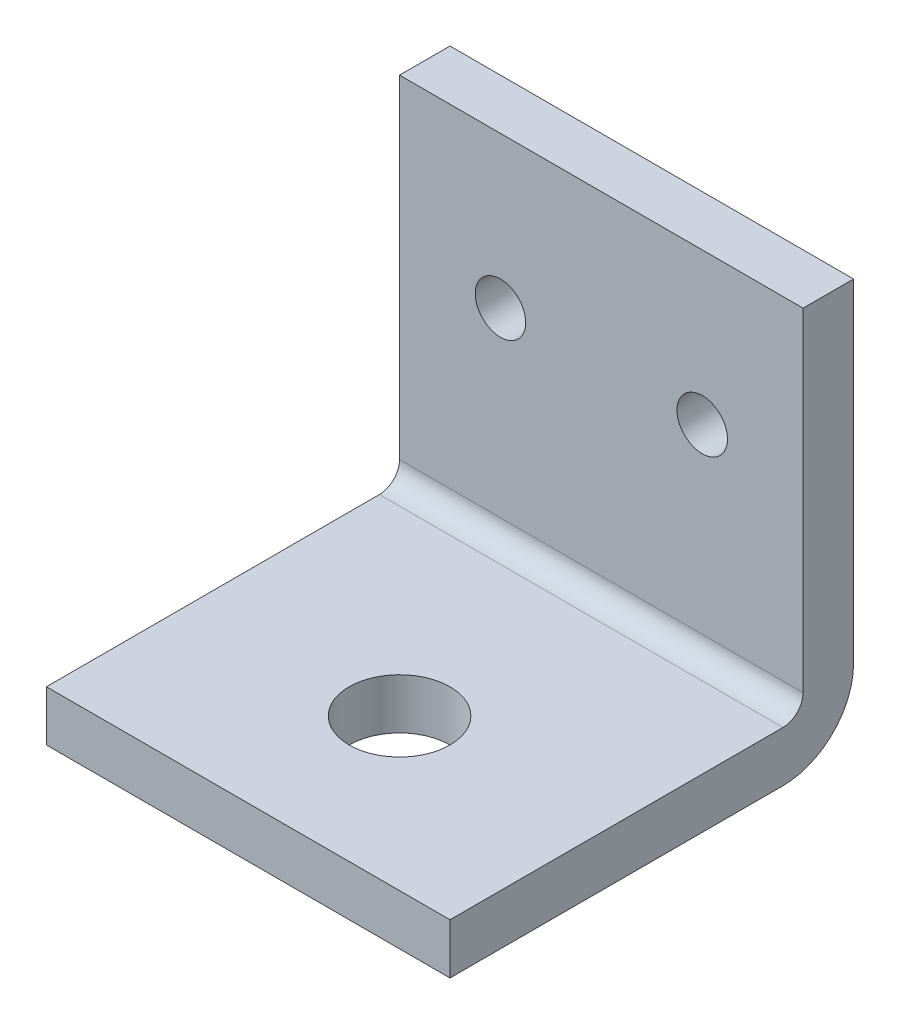
ISO-10303-21;
HEADER;
FILE_DESCRIPTION(('STEP AP214'),'2;1');
FILE_NAME('part.step','',(''),(''),'','','');
FILE_SCHEMA(('AUTOMOTIVE_DESIGN { 1 0 10303 214 1 1 1 1 }'));
ENDSEC;
DATA;
#1=APPLICATION_CONTEXT('core data for automotive mechanical design processes');
#2=APPLICATION_PROTOCOL_DEFINITION('international standard','automotive_design',2000,#1);
#3=PRODUCT_CONTEXT('',#1,'mechanical');
#4=PRODUCT('Part','Part','',(#3));
#5=PRODUCT_RELATED_PRODUCT_CATEGORY('part','',(#4));
#6=PRODUCT_DEFINITION_FORMATION('','',#4);
#7=PRODUCT_DEFINITION_CONTEXT('part definition',#1,'design');
#8=PRODUCT_DEFINITION('design','',#6,#7);
#9=PRODUCT_DEFINITION_SHAPE('','',#8);
#10=(LENGTH_UNIT() NAMED_UNIT(*) SI_UNIT(.MILLI.,.METRE.));
#11=(NAMED_UNIT(*) PLANE_ANGLE_UNIT() SI_UNIT($,.RADIAN.));
#12=(NAMED_UNIT(*) SI_UNIT($,.STERADIAN.) SOLID_ANGLE_UNIT());
#13=UNCERTAINTY_MEASURE_WITH_UNIT(LENGTH_MEASURE(1.E-05),#10,'distance_accuracy_value','');
#14=(GEOMETRIC_REPRESENTATION_CONTEXT(3) GLOBAL_UNCERTAINTY_ASSIGNED_CONTEXT((#13)) GLOBAL_UNIT_ASSIGNED_CONTEXT((#10,
#11,#12)) REPRESENTATION_CONTEXT('',''));
#15=CARTESIAN_POINT('',(0.,0.,0.));
#16=DIRECTION('',(0.,0.,1.));
#17=DIRECTION('',(1.,0.,0.));
#18=AXIS2_PLACEMENT_3D('',#15,#16,#17);
#19=CARTESIAN_POINT('',(40.,40.,5.));
#20=DIRECTION('',(0.,-1.,0.));
#21=DIRECTION('',(0.,0.,-1.));
#22=AXIS2_PLACEMENT_3D('',#19,#20,#21);
#23=PLANE('',#22);
#24=DIRECTION('',(0.,0.,1.));
#25=VECTOR('',#24,1.);
#26=CARTESIAN_POINT('',(0.,40.,5.));
#27=LINE('',#26,#25);
#28=CARTESIAN_POINT('',(0.,40.,0.));
#29=VERTEX_POINT('',#28);
#30=CARTESIAN_POINT('',(0.,40.,5.));
#31=VERTEX_POINT('',#30);
#32=EDGE_CURVE('E136',#29,#31,#27,.T.);
#33=ORIENTED_EDGE('',*,*,#32,.T.);
#34=DIRECTION('',(-1.,0.,0.));
#35=VECTOR('',#34,1.);
#36=CARTESIAN_POINT('',(40.,40.,5.));
#37=LINE('',#36,#35);
#38=CARTESIAN_POINT('',(40.,40.,5.));
#39=VERTEX_POINT('',#38);
#40=EDGE_CURVE('E11',#39,#31,#37,.T.);
#41=ORIENTED_EDGE('',*,*,#40,.F.);
#42=DIRECTION('',(0.,0.,1.));
#43=VECTOR('',#42,1.);
#44=CARTESIAN_POINT('',(40.,40.,5.));
#45=LINE('',#44,#43);
#46=CARTESIAN_POINT('',(40.,40.,0.));
#47=VERTEX_POINT('',#46);
#48=EDGE_CURVE('E151',#47,#39,#45,.T.);
#49=ORIENTED_EDGE('',*,*,#48,.F.);
#50=DIRECTION('',(-1.,0.,0.));
#51=VECTOR('',#50,1.);
#52=CARTESIAN_POINT('',(40.,40.,0.));
#53=LINE('',#52,#51);
#54=EDGE_CURVE('E132',#47,#29,#53,.T.);
#55=ORIENTED_EDGE('',*,*,#54,.T.);
#56=EDGE_LOOP('',(#33,#41,#49,#55));
#57=FACE_BOUND('',#56,.T.);
#58=ADVANCED_FACE('F38',(#57),#23,.F.);
#59=CARTESIAN_POINT('',(40.,6.99999999999999,5.));
#60=DIRECTION('',(0.,0.,-1.));
#61=DIRECTION('',(-1.,0.,0.));
#62=AXIS2_PLACEMENT_3D('',#59,#60,#61);
#63=PLANE('',#62);
#64=CARTESIAN_POINT('',(10.,25.,5.));
#65=DIRECTION('',(0.,0.,1.));
#66=DIRECTION('',(1.,0.,0.));
#67=AXIS2_PLACEMENT_3D('',#64,#65,#66);
#68=CIRCLE('',#67,2.5);
#69=CARTESIAN_POINT('',(12.5,25.,5.));
#70=VERTEX_POINT('',#69);
#71=EDGE_CURVE('E165',#70,#70,#68,.T.);
#72=ORIENTED_EDGE('',*,*,#71,.F.);
#73=EDGE_LOOP('',(#72));
#74=FACE_BOUND('',#73,.T.);
#75=CARTESIAN_POINT('',(30.,25.,5.));
#76=DIRECTION('',(0.,0.,1.));
#77=DIRECTION('',(1.,0.,0.));
#78=AXIS2_PLACEMENT_3D('',#75,#76,#77);
#79=CIRCLE('',#78,2.5);
#80=CARTESIAN_POINT('',(32.5,25.,5.));
#81=VERTEX_POINT('',#80);
#82=EDGE_CURVE('E215',#81,#81,#79,.T.);
#83=ORIENTED_EDGE('',*,*,#82,.F.);
#84=EDGE_LOOP('',(#83));
#85=FACE_BOUND('',#84,.T.);
#86=DIRECTION('',(0.,-1.,0.));
#87=VECTOR('',#86,1.);
#88=CARTESIAN_POINT('',(0.,6.99999999999999,5.));
#89=LINE('',#88,#87);
#90=CARTESIAN_POINT('',(0.,6.99999999999999,5.));
#91=VERTEX_POINT('',#90);
#92=EDGE_CURVE('E139',#31,#91,#89,.T.);
#93=ORIENTED_EDGE('',*,*,#92,.T.);
#94=DIRECTION('',(-1.,0.,0.));
#95=VECTOR('',#94,1.);
#96=CARTESIAN_POINT('',(40.,6.99999999999999,5.));
#97=LINE('',#96,#95);
#98=CARTESIAN_POINT('',(40.,6.99999999999999,5.));
#99=VERTEX_POINT('',#98);
#100=EDGE_CURVE('E47',#99,#91,#97,.T.);
#101=ORIENTED_EDGE('',*,*,#100,.F.);
#102=DIRECTION('',(0.,-1.,0.));
#103=VECTOR('',#102,1.);
#104=CARTESIAN_POINT('',(40.,6.99999999999999,5.));
#105=LINE('',#104,#103);
#106=EDGE_CURVE('E99',#39,#99,#105,.T.);
#107=ORIENTED_EDGE('',*,*,#106,.F.);
#108=ORIENTED_EDGE('',*,*,#40,.T.);
#109=EDGE_LOOP('',(#93,#101,#107,#108));
#110=FACE_BOUND('',#109,.T.);
#111=ADVANCED_FACE('F190',(#74,#85,#110),#63,.F.);
#112=CARTESIAN_POINT('',(40.,6.99999999999999,7.));
#113=DIRECTION('',(-1.,0.,0.));
#114=DIRECTION('',(0.,0.,1.));
#115=AXIS2_PLACEMENT_3D('',#112,#113,#114);
#116=CYLINDRICAL_SURFACE('',#115,2.);
#117=CARTESIAN_POINT('',(0.,6.99999999999999,7.));
#118=DIRECTION('',(-1.,0.,0.));
#119=DIRECTION('',(0.,0.,-1.));
#120=AXIS2_PLACEMENT_3D('',#117,#118,#119);
#121=CIRCLE('',#120,2.);
#122=CARTESIAN_POINT('',(0.,4.99999999999999,7.));
#123=VERTEX_POINT('',#122);
#124=EDGE_CURVE('E142',#91,#123,#121,.T.);
#125=ORIENTED_EDGE('',*,*,#124,.T.);
#126=DIRECTION('',(-1.,0.,0.));
#127=VECTOR('',#126,1.);
#128=CARTESIAN_POINT('',(40.,4.99999999999999,7.));
#129=LINE('',#128,#127);
#130=CARTESIAN_POINT('',(40.,4.99999999999999,7.));
#131=VERTEX_POINT('',#130);
#132=EDGE_CURVE('E158',#131,#123,#129,.T.);
#133=ORIENTED_EDGE('',*,*,#132,.F.);
#134=CARTESIAN_POINT('',(40.,6.99999999999999,7.));
#135=DIRECTION('',(-1.,0.,0.));
#136=DIRECTION('',(0.,0.,-1.));
#137=AXIS2_PLACEMENT_3D('',#134,#135,#136);
#138=CIRCLE('',#137,2.);
#139=EDGE_CURVE('E207',#99,#131,#138,.T.);
#140=ORIENTED_EDGE('',*,*,#139,.F.);
#141=ORIENTED_EDGE('',*,*,#100,.T.);
#142=EDGE_LOOP('',(#125,#133,#140,#141));
#143=FACE_BOUND('',#142,.T.);
#144=ADVANCED_FACE('F196',(#143),#116,.F.);
#145=CARTESIAN_POINT('',(40.,4.99999999999999,40.));
#146=DIRECTION('',(0.,-1.,0.));
#147=DIRECTION('',(0.,0.,-1.));
#148=AXIS2_PLACEMENT_3D('',#145,#146,#147);
#149=PLANE('',#148);
#150=CARTESIAN_POINT('',(20.,4.99999999999999,25.));
#151=DIRECTION('',(0.,-1.,0.));
#152=DIRECTION('',(0.,0.,-1.));
#153=AXIS2_PLACEMENT_3D('',#150,#151,#152);
#154=CIRCLE('',#153,5.);
#155=CARTESIAN_POINT('',(20.,4.99999999999999,30.));
#156=VERTEX_POINT('',#155);
#157=EDGE_CURVE('E218',#156,#156,#154,.T.);
#158=ORIENTED_EDGE('',*,*,#157,.T.);
#159=EDGE_LOOP('',(#158));
#160=FACE_BOUND('',#159,.T.);
#161=DIRECTION('',(0.,0.,1.));
#162=VECTOR('',#161,1.);
#163=CARTESIAN_POINT('',(0.,4.99999999999999,40.));
#164=LINE('',#163,#162);
#165=CARTESIAN_POINT('',(0.,4.99999999999999,40.));
#166=VERTEX_POINT('',#165);
#167=EDGE_CURVE('E144',#123,#166,#164,.T.);
#168=ORIENTED_EDGE('',*,*,#167,.T.);
#169=DIRECTION('',(-1.,0.,0.));
#170=VECTOR('',#169,1.);
#171=CARTESIAN_POINT('',(40.,4.99999999999999,40.));
#172=LINE('',#171,#170);
#173=CARTESIAN_POINT('',(40.,4.99999999999999,40.));
#174=VERTEX_POINT('',#173);
#175=EDGE_CURVE('E155',#174,#166,#172,.T.);
#176=ORIENTED_EDGE('',*,*,#175,.F.);
#177=DIRECTION('',(0.,0.,1.));
#178=VECTOR('',#177,1.);
#179=CARTESIAN_POINT('',(40.,4.99999999999999,40.));
#180=LINE('',#179,#178);
#181=EDGE_CURVE('E209',#131,#174,#180,.T.);
#182=ORIENTED_EDGE('',*,*,#181,.F.);
#183=ORIENTED_EDGE('',*,*,#132,.T.);
#184=EDGE_LOOP('',(#168,#176,#182,#183));
#185=FACE_BOUND('',#184,.T.);
#186=ADVANCED_FACE('F235',(#160,#185),#149,.F.);
#187=CARTESIAN_POINT('',(40.,0.,40.));
#188=DIRECTION('',(0.,0.,-1.));
#189=DIRECTION('',(0.,1.,0.));
#190=AXIS2_PLACEMENT_3D('',#187,#188,#189);
#191=PLANE('',#190);
#192=DIRECTION('',(0.,-1.,0.));
#193=VECTOR('',#192,1.);
#194=CARTESIAN_POINT('',(0.,0.,40.));
#195=LINE('',#194,#193);
#196=CARTESIAN_POINT('',(0.,0.,40.));
#197=VERTEX_POINT('',#196);
#198=EDGE_CURVE('E146',#166,#197,#195,.T.);
#199=ORIENTED_EDGE('',*,*,#198,.T.);
#200=DIRECTION('',(-1.,0.,0.));
#201=VECTOR('',#200,1.);
#202=CARTESIAN_POINT('',(40.,0.,40.));
#203=LINE('',#202,#201);
#204=CARTESIAN_POINT('',(40.,0.,40.));
#205=VERTEX_POINT('',#204);
#206=EDGE_CURVE('E127',#205,#197,#203,.T.);
#207=ORIENTED_EDGE('',*,*,#206,.F.);
#208=DIRECTION('',(0.,-1.,0.));
#209=VECTOR('',#208,1.);
#210=CARTESIAN_POINT('',(40.,0.,40.));
#211=LINE('',#210,#209);
#212=EDGE_CURVE('E118',#174,#205,#211,.T.);
#213=ORIENTED_EDGE('',*,*,#212,.F.);
#214=ORIENTED_EDGE('',*,*,#175,.T.);
#215=EDGE_LOOP('',(#199,#207,#213,#214));
#216=FACE_BOUND('',#215,.T.);
#217=ADVANCED_FACE('F228',(#216),#191,.F.);
#218=CARTESIAN_POINT('',(40.,0.,7.));
#219=DIRECTION('',(0.,1.,0.));
#220=DIRECTION('',(0.,0.,1.));
#221=AXIS2_PLACEMENT_3D('',#218,#219,#220);
#222=PLANE('',#221);
#223=CARTESIAN_POINT('',(20.,0.,25.));
#224=DIRECTION('',(0.,1.,0.));
#225=DIRECTION('',(0.,0.,1.));
#226=AXIS2_PLACEMENT_3D('',#223,#224,#225);
#227=CIRCLE('',#226,5.);
#228=CARTESIAN_POINT('',(20.,0.,30.));
#229=VERTEX_POINT('',#228);
#230=EDGE_CURVE('E41',#229,#229,#227,.T.);
#231=ORIENTED_EDGE('',*,*,#230,.T.);
#232=EDGE_LOOP('',(#231));
#233=FACE_BOUND('',#232,.T.);
#234=DIRECTION('',(0.,0.,-1.));
#235=VECTOR('',#234,1.);
#236=CARTESIAN_POINT('',(0.,0.,7.));
#237=LINE('',#236,#235);
#238=CARTESIAN_POINT('',(0.,0.,7.));
#239=VERTEX_POINT('',#238);
#240=EDGE_CURVE('E126',#197,#239,#237,.T.);
#241=ORIENTED_EDGE('',*,*,#240,.T.);
#242=DIRECTION('',(-1.,0.,0.));
#243=VECTOR('',#242,1.);
#244=CARTESIAN_POINT('',(40.,0.,7.));
#245=LINE('',#244,#243);
#246=CARTESIAN_POINT('',(40.,0.,7.));
#247=VERTEX_POINT('',#246);
#248=EDGE_CURVE('E123',#247,#239,#245,.T.);
#249=ORIENTED_EDGE('',*,*,#248,.F.);
#250=DIRECTION('',(0.,0.,-1.));
#251=VECTOR('',#250,1.);
#252=CARTESIAN_POINT('',(40.,0.,7.));
#253=LINE('',#252,#251);
#254=EDGE_CURVE('E112',#205,#247,#253,.T.);
#255=ORIENTED_EDGE('',*,*,#254,.F.);
#256=ORIENTED_EDGE('',*,*,#206,.T.);
#257=EDGE_LOOP('',(#241,#249,#255,#256));
#258=FACE_BOUND('',#257,.T.);
#259=ADVANCED_FACE('F124',(#233,#258),#222,.F.);
#260=CARTESIAN_POINT('',(40.,6.99999999999999,7.));
#261=DIRECTION('',(-1.,0.,0.));
#262=DIRECTION('',(0.,0.,1.));
#263=AXIS2_PLACEMENT_3D('',#260,#261,#262);
#264=CYLINDRICAL_SURFACE('',#263,7.);
#265=CARTESIAN_POINT('',(0.,6.99999999999999,7.));
#266=DIRECTION('',(1.,0.,0.));
#267=DIRECTION('',(0.,0.,-1.));
#268=AXIS2_PLACEMENT_3D('',#265,#266,#267);
#269=CIRCLE('',#268,7.);
#270=CARTESIAN_POINT('',(0.,6.99999999999999,0.));
#271=VERTEX_POINT('',#270);
#272=EDGE_CURVE('E85',#239,#271,#269,.T.);
#273=ORIENTED_EDGE('',*,*,#272,.T.);
#274=DIRECTION('',(-1.,0.,0.));
#275=VECTOR('',#274,1.);
#276=CARTESIAN_POINT('',(40.,6.99999999999999,0.));
#277=LINE('',#276,#275);
#278=CARTESIAN_POINT('',(40.,6.99999999999999,0.));
#279=VERTEX_POINT('',#278);
#280=EDGE_CURVE('E128',#279,#271,#277,.T.);
#281=ORIENTED_EDGE('',*,*,#280,.F.);
#282=CARTESIAN_POINT('',(40.,6.99999999999999,7.));
#283=DIRECTION('',(1.,0.,0.));
#284=DIRECTION('',(0.,0.,-1.));
#285=AXIS2_PLACEMENT_3D('',#282,#283,#284);
#286=CIRCLE('',#285,7.);
#287=EDGE_CURVE('E116',#247,#279,#286,.T.);
#288=ORIENTED_EDGE('',*,*,#287,.F.);
#289=ORIENTED_EDGE('',*,*,#248,.T.);
#290=EDGE_LOOP('',(#273,#281,#288,#289));
#291=FACE_BOUND('',#290,.T.);
#292=ADVANCED_FACE('F130',(#291),#264,.T.);
#293=CARTESIAN_POINT('',(40.,40.,0.));
#294=DIRECTION('',(0.,0.,1.));
#295=DIRECTION('',(0.,-1.,0.));
#296=AXIS2_PLACEMENT_3D('',#293,#294,#295);
#297=PLANE('',#296);
#298=CARTESIAN_POINT('',(10.,25.,0.));
#299=DIRECTION('',(0.,0.,1.));
#300=DIRECTION('',(0.,-1.,0.));
#301=AXIS2_PLACEMENT_3D('',#298,#299,#300);
#302=CIRCLE('',#301,2.5);
#303=CARTESIAN_POINT('',(10.,22.5,0.));
#304=VERTEX_POINT('',#303);
#305=EDGE_CURVE('E140',#304,#304,#302,.T.);
#306=ORIENTED_EDGE('',*,*,#305,.T.);
#307=EDGE_LOOP('',(#306));
#308=FACE_BOUND('',#307,.T.);
#309=CARTESIAN_POINT('',(30.,25.,0.));
#310=DIRECTION('',(0.,0.,1.));
#311=DIRECTION('',(0.,-1.,0.));
#312=AXIS2_PLACEMENT_3D('',#309,#310,#311);
#313=CIRCLE('',#312,2.5);
#314=CARTESIAN_POINT('',(30.,22.5,0.));
#315=VERTEX_POINT('',#314);
#316=EDGE_CURVE('E163',#315,#315,#313,.T.);
#317=ORIENTED_EDGE('',*,*,#316,.T.);
#318=EDGE_LOOP('',(#317));
#319=FACE_BOUND('',#318,.T.);
#320=DIRECTION('',(0.,1.,0.));
#321=VECTOR('',#320,1.);
#322=CARTESIAN_POINT('',(0.,40.,0.));
#323=LINE('',#322,#321);
#324=EDGE_CURVE('E91',#271,#29,#323,.T.);
#325=ORIENTED_EDGE('',*,*,#324,.T.);
#326=ORIENTED_EDGE('',*,*,#54,.F.);
#327=DIRECTION('',(0.,1.,0.));
#328=VECTOR('',#327,1.);
#329=CARTESIAN_POINT('',(40.,40.,0.));
#330=LINE('',#329,#328);
#331=EDGE_CURVE('E56',#279,#47,#330,.T.);
#332=ORIENTED_EDGE('',*,*,#331,.F.);
#333=ORIENTED_EDGE('',*,*,#280,.T.);
#334=EDGE_LOOP('',(#325,#326,#332,#333));
#335=FACE_BOUND('',#334,.T.);
#336=ADVANCED_FACE('F169',(#308,#319,#335),#297,.F.);
#337=CARTESIAN_POINT('',(40.,6.99999999999999,7.));
#338=DIRECTION('',(1.,0.,0.));
#339=DIRECTION('',(0.,0.,-1.));
#340=AXIS2_PLACEMENT_3D('',#337,#338,#339);
#341=PLANE('',#340);
#342=ORIENTED_EDGE('',*,*,#48,.T.);
#343=ORIENTED_EDGE('',*,*,#106,.T.);
#344=ORIENTED_EDGE('',*,*,#139,.T.);
#345=ORIENTED_EDGE('',*,*,#181,.T.);
#346=ORIENTED_EDGE('',*,*,#212,.T.);
#347=ORIENTED_EDGE('',*,*,#254,.T.);
#348=ORIENTED_EDGE('',*,*,#287,.T.);
#349=ORIENTED_EDGE('',*,*,#331,.T.);
#350=EDGE_LOOP('',(#342,#343,#344,#345,#346,#347,#348,#349));
#351=FACE_BOUND('',#350,.T.);
#352=ADVANCED_FACE('F114',(#351),#341,.T.);
#353=CARTESIAN_POINT('',(0.,6.99999999999999,7.));
#354=DIRECTION('',(1.,0.,0.));
#355=DIRECTION('',(0.,0.,-1.));
#356=AXIS2_PLACEMENT_3D('',#353,#354,#355);
#357=PLANE('',#356);
#358=ORIENTED_EDGE('',*,*,#32,.F.);
#359=ORIENTED_EDGE('',*,*,#324,.F.);
#360=ORIENTED_EDGE('',*,*,#272,.F.);
#361=ORIENTED_EDGE('',*,*,#240,.F.);
#362=ORIENTED_EDGE('',*,*,#198,.F.);
#363=ORIENTED_EDGE('',*,*,#167,.F.);
#364=ORIENTED_EDGE('',*,*,#124,.F.);
#365=ORIENTED_EDGE('',*,*,#92,.F.);
#366=EDGE_LOOP('',(#358,#359,#360,#361,#362,#363,#364,#365));
#367=FACE_BOUND('',#366,.T.);
#368=ADVANCED_FACE('F185',(#367),#357,.F.);
#369=CARTESIAN_POINT('',(30.,25.,-35.));
#370=DIRECTION('',(0.,0.,1.));
#371=DIRECTION('',(1.,0.,0.));
#372=AXIS2_PLACEMENT_3D('',#369,#370,#371);
#373=CYLINDRICAL_SURFACE('',#372,2.5);
#374=ORIENTED_EDGE('',*,*,#82,.T.);
#375=EDGE_LOOP('',(#374));
#376=FACE_BOUND('',#375,.T.);
#377=ORIENTED_EDGE('',*,*,#316,.F.);
#378=EDGE_LOOP('',(#377));
#379=FACE_BOUND('',#378,.T.);
#380=ADVANCED_FACE('F175',(#376,#379),#373,.F.);
#381=CARTESIAN_POINT('',(10.,25.,-35.));
#382=DIRECTION('',(0.,0.,1.));
#383=DIRECTION('',(1.,0.,0.));
#384=AXIS2_PLACEMENT_3D('',#381,#382,#383);
#385=CYLINDRICAL_SURFACE('',#384,2.5);
#386=ORIENTED_EDGE('',*,*,#71,.T.);
#387=EDGE_LOOP('',(#386));
#388=FACE_BOUND('',#387,.T.);
#389=ORIENTED_EDGE('',*,*,#305,.F.);
#390=EDGE_LOOP('',(#389));
#391=FACE_BOUND('',#390,.T.);
#392=ADVANCED_FACE('F172',(#388,#391),#385,.F.);
#393=CARTESIAN_POINT('',(20.,-1.2E-05,25.));
#394=DIRECTION('',(0.,1.,0.));
#395=DIRECTION('',(0.,0.,1.));
#396=AXIS2_PLACEMENT_3D('',#393,#394,#395);
#397=CYLINDRICAL_SURFACE('',#396,5.);
#398=CARTESIAN_POINT('',(20.,0.,30.));
#399=CARTESIAN_POINT('',(20.,0.0520833333333333,30.));
#400=CARTESIAN_POINT('',(20.,0.104166666666666,30.));
#401=CARTESIAN_POINT('',(20.,0.208333333333333,30.));
#402=CARTESIAN_POINT('',(20.,0.260416666666666,30.));
#403=CARTESIAN_POINT('',(20.,0.364583333333333,30.));
#404=CARTESIAN_POINT('',(20.,0.416666666666666,30.));
#405=CARTESIAN_POINT('',(20.,0.520833333333333,30.));
#406=CARTESIAN_POINT('',(20.,0.572916666666666,30.));
#407=CARTESIAN_POINT('',(20.,0.677083333333332,30.));
#408=CARTESIAN_POINT('',(20.,0.729166666666666,30.));
#409=CARTESIAN_POINT('',(20.,0.833333333333332,30.));
#410=CARTESIAN_POINT('',(20.,0.885416666666665,30.));
#411=CARTESIAN_POINT('',(20.,0.989583333333332,30.));
#412=CARTESIAN_POINT('',(20.,1.04166666666667,30.));
#413=CARTESIAN_POINT('',(20.,1.14583333333333,30.));
#414=CARTESIAN_POINT('',(20.,1.19791666666666,30.));
#415=CARTESIAN_POINT('',(20.,1.30208333333333,30.));
#416=CARTESIAN_POINT('',(20.,1.35416666666666,30.));
#417=CARTESIAN_POINT('',(20.,1.45833333333333,30.));
#418=CARTESIAN_POINT('',(20.,1.51041666666666,30.));
#419=CARTESIAN_POINT('',(20.,1.61458333333333,30.));
#420=CARTESIAN_POINT('',(20.,1.66666666666666,30.));
#421=CARTESIAN_POINT('',(20.,1.77083333333333,30.));
#422=CARTESIAN_POINT('',(20.,1.82291666666666,30.));
#423=CARTESIAN_POINT('',(20.,1.92708333333333,30.));
#424=CARTESIAN_POINT('',(20.,1.97916666666666,30.));
#425=CARTESIAN_POINT('',(20.,2.08333333333333,30.));
#426=CARTESIAN_POINT('',(20.,2.13541666666666,30.));
#427=CARTESIAN_POINT('',(20.,2.23958333333333,30.));
#428=CARTESIAN_POINT('',(20.,2.29166666666666,30.));
#429=CARTESIAN_POINT('',(20.,2.39583333333333,30.));
#430=CARTESIAN_POINT('',(20.,2.44791666666666,30.));
#431=CARTESIAN_POINT('',(20.,2.55208333333333,30.));
#432=CARTESIAN_POINT('',(20.,2.60416666666666,30.));
#433=CARTESIAN_POINT('',(20.,2.70833333333333,30.));
#434=CARTESIAN_POINT('',(20.,2.76041666666666,30.));
#435=CARTESIAN_POINT('',(20.,2.86458333333333,30.));
#436=CARTESIAN_POINT('',(20.,2.91666666666666,30.));
#437=CARTESIAN_POINT('',(20.,3.02083333333333,30.));
#438=CARTESIAN_POINT('',(20.,3.07291666666666,30.));
#439=CARTESIAN_POINT('',(20.,3.17708333333333,30.));
#440=CARTESIAN_POINT('',(20.,3.22916666666666,30.));
#441=CARTESIAN_POINT('',(20.,3.33333333333333,30.));
#442=CARTESIAN_POINT('',(20.,3.38541666666666,30.));
#443=CARTESIAN_POINT('',(20.,3.48958333333333,30.));
#444=CARTESIAN_POINT('',(20.,3.54166666666666,30.));
#445=CARTESIAN_POINT('',(20.,3.64583333333333,30.));
#446=CARTESIAN_POINT('',(20.,3.69791666666666,30.));
#447=CARTESIAN_POINT('',(20.,3.80208333333333,30.));
#448=CARTESIAN_POINT('',(20.,3.85416666666666,30.));
#449=CARTESIAN_POINT('',(20.,3.95833333333333,30.));
#450=CARTESIAN_POINT('',(20.,4.01041666666666,30.));
#451=CARTESIAN_POINT('',(20.,4.11458333333333,30.));
#452=CARTESIAN_POINT('',(20.,4.16666666666666,30.));
#453=CARTESIAN_POINT('',(20.,4.27083333333333,30.));
#454=CARTESIAN_POINT('',(20.,4.32291666666666,30.));
#455=CARTESIAN_POINT('',(20.,4.42708333333333,30.));
#456=CARTESIAN_POINT('',(20.,4.47916666666666,30.));
#457=CARTESIAN_POINT('',(20.,4.58333333333333,30.));
#458=CARTESIAN_POINT('',(20.,4.63541666666666,30.));
#459=CARTESIAN_POINT('',(20.,4.73958333333333,30.));
#460=CARTESIAN_POINT('',(20.,4.79166666666666,30.));
#461=CARTESIAN_POINT('',(20.,4.89583333333333,30.));
#462=CARTESIAN_POINT('',(20.,4.94791666666666,30.));
#463=CARTESIAN_POINT('',(20.,4.99999999999999,30.));
#464=B_SPLINE_CURVE_WITH_KNOTS('',3,(#398,#399,#400,#401,#402,#403,#404,#405,#406,#407,#408,
#409,#410,#411,#412,#413,#414,#415,#416,#417,#418,#419,#420,#421,#422,#423,#424,#425,#426,#427,
#428,#429,#430,#431,#432,#433,#434,#435,#436,#437,#438,#439,#440,#441,#442,#443,#444,#445,#446,
#447,#448,#449,#450,#451,#452,#453,#454,#455,#456,#457,#458,#459,#460,#461,#462,#463),
.UNSPECIFIED.,.F.,.F.,(4,2,2,2,2,2,2,2,2,2,2,2,2,2,2,2,2,2,2,2,2,2,2,2,2,2,2,2,2,2,2,2,4),(0.,
0.15625,0.3125,0.468749999999999,0.624999999999999,0.781249999999999,0.937499999999999,1.09375,
1.25,1.40625,1.5625,1.71875,1.875,2.03125,2.1875,2.34375,2.5,2.65625,2.8125,2.96875,3.125,
3.28125,3.43749999999999,3.59374999999999,3.74999999999999,3.90624999999999,4.06249999999999,
4.21874999999999,4.37499999999999,4.53124999999999,4.68749999999999,4.84374999999999,
4.99999999999999),.UNSPECIFIED.);
#465=EDGE_CURVE('BSEAM174',#229,#156,#464,.T.);
#466=ORIENTED_EDGE('',*,*,#230,.F.);
#467=ORIENTED_EDGE('',*,*,#157,.F.);
#468=ORIENTED_EDGE('',*,*,#465,.T.);
#469=ORIENTED_EDGE('',*,*,#465,.F.);
#470=EDGE_LOOP('',(#466,#468,#467,#469));
#471=FACE_BOUND('',#470,.T.);
#472=ADVANCED_FACE('F174',(#471),#397,.F.);
#473=CLOSED_SHELL('',(#58,#111,#144,#186,#217,#259,#292,#336,#352,#368,#380,#392,#472));
#474=MANIFOLD_SOLID_BREP('B2',#473);
#475=ADVANCED_BREP_SHAPE_REPRESENTATION('',(#18,#474),#14);
#476=SHAPE_DEFINITION_REPRESENTATION(#9,#475);
ENDSEC;
END-ISO-10303-21;
